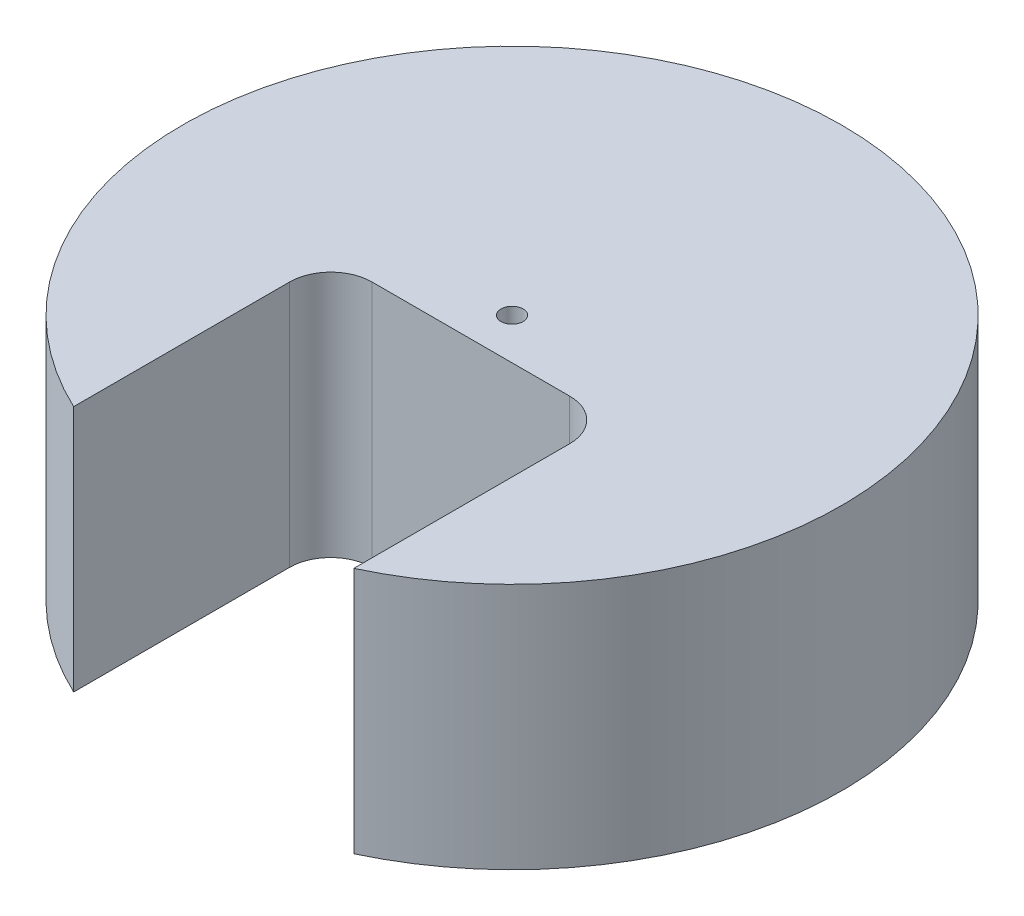
ISO-10303-21;
HEADER;
FILE_DESCRIPTION(('STEP AP214'),'2;1');
FILE_NAME('part.step','',(''),(''),'','','');
FILE_SCHEMA(('AUTOMOTIVE_DESIGN { 1 0 10303 214 1 1 1 1 }'));
ENDSEC;
DATA;
#1=APPLICATION_CONTEXT('core data for automotive mechanical design processes');
#2=APPLICATION_PROTOCOL_DEFINITION('international standard','automotive_design',2000,#1);
#3=PRODUCT_CONTEXT('',#1,'mechanical');
#4=PRODUCT('Part','Part','',(#3));
#5=PRODUCT_RELATED_PRODUCT_CATEGORY('part','',(#4));
#6=PRODUCT_DEFINITION_FORMATION('','',#4);
#7=PRODUCT_DEFINITION_CONTEXT('part definition',#1,'design');
#8=PRODUCT_DEFINITION('design','',#6,#7);
#9=PRODUCT_DEFINITION_SHAPE('','',#8);
#10=(LENGTH_UNIT() NAMED_UNIT(*) SI_UNIT(.MILLI.,.METRE.));
#11=(NAMED_UNIT(*) PLANE_ANGLE_UNIT() SI_UNIT($,.RADIAN.));
#12=(NAMED_UNIT(*) SI_UNIT($,.STERADIAN.) SOLID_ANGLE_UNIT());
#13=UNCERTAINTY_MEASURE_WITH_UNIT(LENGTH_MEASURE(1.E-05),#10,'distance_accuracy_value','');
#14=(GEOMETRIC_REPRESENTATION_CONTEXT(3) GLOBAL_UNCERTAINTY_ASSIGNED_CONTEXT((#13)) GLOBAL_UNIT_ASSIGNED_CONTEXT((#10,
#11,#12)) REPRESENTATION_CONTEXT('',''));
#15=CARTESIAN_POINT('',(0.,0.,0.));
#16=DIRECTION('',(0.,0.,1.));
#17=DIRECTION('',(1.,0.,0.));
#18=AXIS2_PLACEMENT_3D('',#15,#16,#17);
#19=CARTESIAN_POINT('',(0.,38.1,0.));
#20=DIRECTION('',(0.,-1.,0.));
#21=DIRECTION('',(0.,0.,-1.));
#22=AXIS2_PLACEMENT_3D('',#19,#20,#21);
#23=CYLINDRICAL_SURFACE('',#22,50.8);
#24=CARTESIAN_POINT('',(0.,0.,0.));
#25=DIRECTION('',(0.,1.,0.));
#26=DIRECTION('',(0.,0.,1.));
#27=AXIS2_PLACEMENT_3D('',#24,#25,#26);
#28=CIRCLE('',#27,50.8);
#29=CARTESIAN_POINT('',(21.59,0.,45.9838221551885));
#30=VERTEX_POINT('',#29);
#31=CARTESIAN_POINT('',(-21.59,0.,45.9838221551885));
#32=VERTEX_POINT('',#31);
#33=EDGE_CURVE('E109',#30,#32,#28,.T.);
#34=ORIENTED_EDGE('',*,*,#33,.T.);
#35=DIRECTION('',(0.,-1.,0.));
#36=VECTOR('',#35,1.);
#37=CARTESIAN_POINT('',(-21.59,38.1,45.9838221551884));
#38=LINE('',#37,#36);
#39=CARTESIAN_POINT('',(-21.59,38.1,45.9838221551885));
#40=VERTEX_POINT('',#39);
#41=EDGE_CURVE('E95',#40,#32,#38,.T.);
#42=ORIENTED_EDGE('',*,*,#41,.F.);
#43=CARTESIAN_POINT('',(0.,38.1,0.));
#44=DIRECTION('',(0.,1.,0.));
#45=DIRECTION('',(0.,0.,1.));
#46=AXIS2_PLACEMENT_3D('',#43,#44,#45);
#47=CIRCLE('',#46,50.8);
#48=CARTESIAN_POINT('',(21.59,38.1,45.9838221551885));
#49=VERTEX_POINT('',#48);
#50=EDGE_CURVE('E107',#49,#40,#47,.T.);
#51=ORIENTED_EDGE('',*,*,#50,.F.);
#52=DIRECTION('',(0.,-1.,0.));
#53=VECTOR('',#52,1.);
#54=CARTESIAN_POINT('',(21.59,38.1,45.9838221551884));
#55=LINE('',#54,#53);
#56=EDGE_CURVE('E112',#30,#49,#55,.F.);
#57=ORIENTED_EDGE('',*,*,#56,.F.);
#58=EDGE_LOOP('',(#34,#42,#51,#57));
#59=FACE_BOUND('',#58,.T.);
#60=ADVANCED_FACE('F39',(#59),#23,.T.);
#61=CARTESIAN_POINT('',(0.,38.1,0.));
#62=DIRECTION('',(0.,1.,0.));
#63=DIRECTION('',(0.,0.,1.));
#64=AXIS2_PLACEMENT_3D('',#61,#62,#63);
#65=PLANE('',#64);
#66=CARTESIAN_POINT('',(0.,38.1,0.));
#67=DIRECTION('',(0.,1.,0.));
#68=DIRECTION('',(0.,0.,1.));
#69=AXIS2_PLACEMENT_3D('',#66,#67,#68);
#70=CIRCLE('',#69,1.69999999999999);
#71=CARTESIAN_POINT('',(0.,38.1,1.69999999999999));
#72=VERTEX_POINT('',#71);
#73=EDGE_CURVE('E247',#72,#72,#70,.T.);
#74=ORIENTED_EDGE('',*,*,#73,.F.);
#75=EDGE_LOOP('',(#74));
#76=FACE_BOUND('',#75,.T.);
#77=DIRECTION('',(0.,0.,1.));
#78=VECTOR('',#77,1.);
#79=CARTESIAN_POINT('',(-21.59,38.1,6.35));
#80=LINE('',#79,#78);
#81=CARTESIAN_POINT('',(-21.59,38.1,12.7));
#82=VERTEX_POINT('',#81);
#83=EDGE_CURVE('E92',#82,#40,#80,.T.);
#84=ORIENTED_EDGE('',*,*,#83,.F.);
#85=CARTESIAN_POINT('',(-15.24,38.1,12.7));
#86=DIRECTION('',(0.,1.,0.));
#87=DIRECTION('',(0.,0.,1.));
#88=AXIS2_PLACEMENT_3D('',#85,#86,#87);
#89=CIRCLE('',#88,6.35);
#90=CARTESIAN_POINT('',(-15.24,38.1,6.35));
#91=VERTEX_POINT('',#90);
#92=EDGE_CURVE('E48',#82,#91,#89,.F.);
#93=ORIENTED_EDGE('',*,*,#92,.T.);
#94=DIRECTION('',(-1.,0.,0.));
#95=VECTOR('',#94,1.);
#96=CARTESIAN_POINT('',(-21.59,38.1,6.35));
#97=LINE('',#96,#95);
#98=CARTESIAN_POINT('',(15.24,38.1,6.35));
#99=VERTEX_POINT('',#98);
#100=EDGE_CURVE('E124',#99,#91,#97,.T.);
#101=ORIENTED_EDGE('',*,*,#100,.F.);
#102=CARTESIAN_POINT('',(15.24,38.1,12.7));
#103=DIRECTION('',(0.,1.,0.));
#104=DIRECTION('',(0.,0.,1.));
#105=AXIS2_PLACEMENT_3D('',#102,#103,#104);
#106=CIRCLE('',#105,6.35);
#107=CARTESIAN_POINT('',(21.59,38.1,12.7));
#108=VERTEX_POINT('',#107);
#109=EDGE_CURVE('E137',#99,#108,#106,.F.);
#110=ORIENTED_EDGE('',*,*,#109,.T.);
#111=DIRECTION('',(0.,0.,-1.));
#112=VECTOR('',#111,1.);
#113=CARTESIAN_POINT('',(21.59,38.1,6.35));
#114=LINE('',#113,#112);
#115=EDGE_CURVE('E100',#49,#108,#114,.T.);
#116=ORIENTED_EDGE('',*,*,#115,.F.);
#117=ORIENTED_EDGE('',*,*,#50,.T.);
#118=EDGE_LOOP('',(#84,#93,#101,#110,#116,#117));
#119=FACE_BOUND('',#118,.T.);
#120=ADVANCED_FACE('F115',(#76,#119),#65,.T.);
#121=CARTESIAN_POINT('',(0.,0.,0.));
#122=DIRECTION('',(0.,1.,0.));
#123=DIRECTION('',(0.,0.,1.));
#124=AXIS2_PLACEMENT_3D('',#121,#122,#123);
#125=PLANE('',#124);
#126=CARTESIAN_POINT('',(0.,0.,0.));
#127=DIRECTION('',(0.,1.,0.));
#128=DIRECTION('',(0.,0.,1.));
#129=AXIS2_PLACEMENT_3D('',#126,#127,#128);
#130=CIRCLE('',#129,1.69999999999999);
#131=CARTESIAN_POINT('',(0.,0.,1.69999999999999));
#132=VERTEX_POINT('',#131);
#133=EDGE_CURVE('E243',#132,#132,#130,.T.);
#134=ORIENTED_EDGE('',*,*,#133,.T.);
#135=EDGE_LOOP('',(#134));
#136=FACE_BOUND('',#135,.T.);
#137=DIRECTION('',(1.,0.,0.));
#138=VECTOR('',#137,1.);
#139=CARTESIAN_POINT('',(-21.59,0.,6.35));
#140=LINE('',#139,#138);
#141=CARTESIAN_POINT('',(-15.24,0.,6.35));
#142=VERTEX_POINT('',#141);
#143=CARTESIAN_POINT('',(15.24,0.,6.35));
#144=VERTEX_POINT('',#143);
#145=EDGE_CURVE('E233',#142,#144,#140,.T.);
#146=ORIENTED_EDGE('',*,*,#145,.F.);
#147=CARTESIAN_POINT('',(-15.24,0.,12.7));
#148=DIRECTION('',(0.,1.,0.));
#149=DIRECTION('',(0.,0.,1.));
#150=AXIS2_PLACEMENT_3D('',#147,#148,#149);
#151=CIRCLE('',#150,6.35);
#152=CARTESIAN_POINT('',(-21.59,0.,12.7));
#153=VERTEX_POINT('',#152);
#154=EDGE_CURVE('E11',#142,#153,#151,.T.);
#155=ORIENTED_EDGE('',*,*,#154,.T.);
#156=DIRECTION('',(0.,0.,-1.));
#157=VECTOR('',#156,1.);
#158=CARTESIAN_POINT('',(-21.59,0.,6.35));
#159=LINE('',#158,#157);
#160=EDGE_CURVE('E101',#32,#153,#159,.T.);
#161=ORIENTED_EDGE('',*,*,#160,.F.);
#162=ORIENTED_EDGE('',*,*,#33,.F.);
#163=DIRECTION('',(0.,0.,1.));
#164=VECTOR('',#163,1.);
#165=CARTESIAN_POINT('',(21.59,0.,6.35));
#166=LINE('',#165,#164);
#167=CARTESIAN_POINT('',(21.59,0.,12.7));
#168=VERTEX_POINT('',#167);
#169=EDGE_CURVE('E111',#168,#30,#166,.T.);
#170=ORIENTED_EDGE('',*,*,#169,.F.);
#171=CARTESIAN_POINT('',(15.24,0.,12.7));
#172=DIRECTION('',(0.,1.,0.));
#173=DIRECTION('',(0.,0.,1.));
#174=AXIS2_PLACEMENT_3D('',#171,#172,#173);
#175=CIRCLE('',#174,6.35);
#176=EDGE_CURVE('E140',#168,#144,#175,.T.);
#177=ORIENTED_EDGE('',*,*,#176,.T.);
#178=EDGE_LOOP('',(#146,#155,#161,#162,#170,#177));
#179=FACE_BOUND('',#178,.T.);
#180=ADVANCED_FACE('F166',(#136,#179),#125,.F.);
#181=CARTESIAN_POINT('',(-21.59,-0.001000000000001,6.35));
#182=DIRECTION('',(-1.,0.,0.));
#183=DIRECTION('',(0.,0.,1.));
#184=AXIS2_PLACEMENT_3D('',#181,#182,#183);
#185=PLANE('',#184);
#186=ORIENTED_EDGE('',*,*,#160,.T.);
#187=DIRECTION('',(0.,1.,0.));
#188=VECTOR('',#187,1.);
#189=CARTESIAN_POINT('',(-21.59,38.1,12.7));
#190=LINE('',#189,#188);
#191=EDGE_CURVE('E96',#153,#82,#190,.T.);
#192=ORIENTED_EDGE('',*,*,#191,.T.);
#193=ORIENTED_EDGE('',*,*,#83,.T.);
#194=ORIENTED_EDGE('',*,*,#41,.T.);
#195=EDGE_LOOP('',(#186,#192,#193,#194));
#196=FACE_BOUND('',#195,.T.);
#197=ADVANCED_FACE('F94',(#196),#185,.F.);
#198=CARTESIAN_POINT('',(-21.59,-0.001000000000001,6.35));
#199=DIRECTION('',(0.,0.,-1.));
#200=DIRECTION('',(-1.,0.,0.));
#201=AXIS2_PLACEMENT_3D('',#198,#199,#200);
#202=PLANE('',#201);
#203=ORIENTED_EDGE('',*,*,#145,.T.);
#204=DIRECTION('',(0.,1.,0.));
#205=VECTOR('',#204,1.);
#206=CARTESIAN_POINT('',(15.24,38.1,6.35));
#207=LINE('',#206,#205);
#208=EDGE_CURVE('E122',#144,#99,#207,.T.);
#209=ORIENTED_EDGE('',*,*,#208,.T.);
#210=ORIENTED_EDGE('',*,*,#100,.T.);
#211=DIRECTION('',(0.,1.,0.));
#212=VECTOR('',#211,1.);
#213=CARTESIAN_POINT('',(-15.24,0.,6.35));
#214=LINE('',#213,#212);
#215=EDGE_CURVE('E118',#91,#142,#214,.F.);
#216=ORIENTED_EDGE('',*,*,#215,.T.);
#217=EDGE_LOOP('',(#203,#209,#210,#216));
#218=FACE_BOUND('',#217,.T.);
#219=ADVANCED_FACE('F147',(#218),#202,.F.);
#220=CARTESIAN_POINT('',(21.59,-0.001000000000001,6.35));
#221=DIRECTION('',(1.,0.,0.));
#222=DIRECTION('',(0.,0.,-1.));
#223=AXIS2_PLACEMENT_3D('',#220,#221,#222);
#224=PLANE('',#223);
#225=ORIENTED_EDGE('',*,*,#115,.T.);
#226=DIRECTION('',(0.,1.,0.));
#227=VECTOR('',#226,1.);
#228=CARTESIAN_POINT('',(21.59,0.,12.7));
#229=LINE('',#228,#227);
#230=EDGE_CURVE('E132',#108,#168,#229,.F.);
#231=ORIENTED_EDGE('',*,*,#230,.T.);
#232=ORIENTED_EDGE('',*,*,#169,.T.);
#233=ORIENTED_EDGE('',*,*,#56,.T.);
#234=EDGE_LOOP('',(#225,#231,#232,#233));
#235=FACE_BOUND('',#234,.T.);
#236=ADVANCED_FACE('F159',(#235),#224,.F.);
#237=CARTESIAN_POINT('',(15.24,-0.001000000000001,12.7));
#238=DIRECTION('',(0.,-1.,0.));
#239=DIRECTION('',(0.,0.,-1.));
#240=AXIS2_PLACEMENT_3D('',#237,#238,#239);
#241=CYLINDRICAL_SURFACE('',#240,6.35);
#242=ORIENTED_EDGE('',*,*,#176,.F.);
#243=ORIENTED_EDGE('',*,*,#230,.F.);
#244=ORIENTED_EDGE('',*,*,#109,.F.);
#245=ORIENTED_EDGE('',*,*,#208,.F.);
#246=EDGE_LOOP('',(#242,#243,#244,#245));
#247=FACE_BOUND('',#246,.T.);
#248=ADVANCED_FACE('F152',(#247),#241,.F.);
#249=CARTESIAN_POINT('',(-15.24,-0.001000000000001,12.7));
#250=DIRECTION('',(0.,-1.,0.));
#251=DIRECTION('',(0.,0.,-1.));
#252=AXIS2_PLACEMENT_3D('',#249,#250,#251);
#253=CYLINDRICAL_SURFACE('',#252,6.35);
#254=ORIENTED_EDGE('',*,*,#154,.F.);
#255=ORIENTED_EDGE('',*,*,#215,.F.);
#256=ORIENTED_EDGE('',*,*,#92,.F.);
#257=ORIENTED_EDGE('',*,*,#191,.F.);
#258=EDGE_LOOP('',(#254,#255,#256,#257));
#259=FACE_BOUND('',#258,.T.);
#260=ADVANCED_FACE('F41',(#259),#253,.F.);
#261=CARTESIAN_POINT('',(0.,38.1,0.));
#262=DIRECTION('',(0.,1.,0.));
#263=DIRECTION('',(0.,0.,1.));
#264=AXIS2_PLACEMENT_3D('',#261,#262,#263);
#265=CYLINDRICAL_SURFACE('',#264,1.69999999999999);
#266=ORIENTED_EDGE('',*,*,#133,.F.);
#267=EDGE_LOOP('',(#266));
#268=FACE_BOUND('',#267,.T.);
#269=ORIENTED_EDGE('',*,*,#73,.T.);
#270=EDGE_LOOP('',(#269));
#271=FACE_BOUND('',#270,.T.);
#272=ADVANCED_FACE('F151',(#268,#271),#265,.F.);
#273=CLOSED_SHELL('',(#60,#120,#180,#197,#219,#236,#248,#260,#272));
#274=MANIFOLD_SOLID_BREP('B2',#273);
#275=ADVANCED_BREP_SHAPE_REPRESENTATION('',(#18,#274),#14);
#276=SHAPE_DEFINITION_REPRESENTATION(#9,#275);
ENDSEC;
END-ISO-10303-21;
